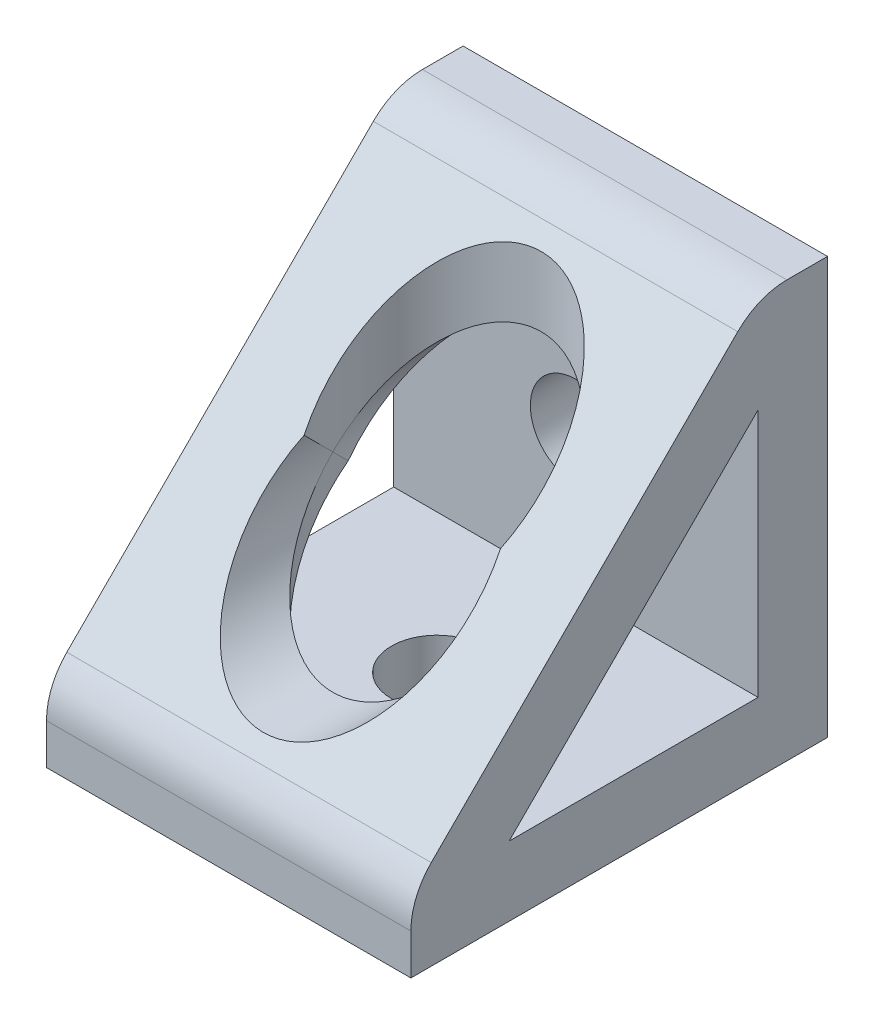
ISO-10303-21;
HEADER;
FILE_DESCRIPTION(('STEP AP214'),'2;1');
FILE_NAME('part.step','',(''),(''),'','','');
FILE_SCHEMA(('AUTOMOTIVE_DESIGN { 1 0 10303 214 1 1 1 1 }'));
ENDSEC;
DATA;
#1=APPLICATION_CONTEXT('core data for automotive mechanical design processes');
#2=APPLICATION_PROTOCOL_DEFINITION('international standard','automotive_design',2000,#1);
#3=PRODUCT_CONTEXT('',#1,'mechanical');
#4=PRODUCT('Part','Part','',(#3));
#5=PRODUCT_RELATED_PRODUCT_CATEGORY('part','',(#4));
#6=PRODUCT_DEFINITION_FORMATION('','',#4);
#7=PRODUCT_DEFINITION_CONTEXT('part definition',#1,'design');
#8=PRODUCT_DEFINITION('design','',#6,#7);
#9=PRODUCT_DEFINITION_SHAPE('','',#8);
#10=(LENGTH_UNIT() NAMED_UNIT(*) SI_UNIT(.MILLI.,.METRE.));
#11=(NAMED_UNIT(*) PLANE_ANGLE_UNIT() SI_UNIT($,.RADIAN.));
#12=(NAMED_UNIT(*) SI_UNIT($,.STERADIAN.) SOLID_ANGLE_UNIT());
#13=UNCERTAINTY_MEASURE_WITH_UNIT(LENGTH_MEASURE(1.E-05),#10,'distance_accuracy_value','');
#14=(GEOMETRIC_REPRESENTATION_CONTEXT(3) GLOBAL_UNCERTAINTY_ASSIGNED_CONTEXT((#13)) GLOBAL_UNIT_ASSIGNED_CONTEXT((#10,
#11,#12)) REPRESENTATION_CONTEXT('',''));
#15=CARTESIAN_POINT('',(0.,0.,0.));
#16=DIRECTION('',(0.,0.,1.));
#17=DIRECTION('',(1.,0.,0.));
#18=AXIS2_PLACEMENT_3D('',#15,#16,#17);
#19=CARTESIAN_POINT('',(0.,0.,-39.6407683632074));
#20=DIRECTION('',(0.,0.,1.));
#21=DIRECTION('',(1.,0.,0.));
#22=AXIS2_PLACEMENT_3D('',#19,#20,#21);
#23=CYLINDRICAL_SURFACE('',#22,9.525);
#24=CARTESIAN_POINT('',(0.,0.,0.));
#25=DIRECTION('',(0.,-0.707106781186549,0.707106781186546));
#26=DIRECTION('',(0.,0.707106781186546,0.707106781186549));
#27=AXIS2_PLACEMENT_3D('',#24,#25,#26);
#28=ELLIPSE('',#27,13.4703841816038,9.525);
#29=CARTESIAN_POINT('',(8.98025612106915,3.175,3.17500000000002));
#30=VERTEX_POINT('',#29);
#31=CARTESIAN_POINT('',(9.525,0.,0.));
#32=VERTEX_POINT('',#31);
#33=EDGE_CURVE('E62',#30,#32,#28,.F.);
#34=ORIENTED_EDGE('',*,*,#33,.T.);
#35=CARTESIAN_POINT('',(0.,0.,0.));
#36=DIRECTION('',(0.,0.707106781186546,0.707106781186549));
#37=DIRECTION('',(0.,-0.707106781186549,0.707106781186546));
#38=AXIS2_PLACEMENT_3D('',#35,#36,#37);
#39=ELLIPSE('',#38,13.4703841816037,9.525);
#40=CARTESIAN_POINT('',(-9.525,0.,0.));
#41=VERTEX_POINT('',#40);
#42=EDGE_CURVE('E11',#32,#41,#39,.F.);
#43=ORIENTED_EDGE('',*,*,#42,.T.);
#44=CARTESIAN_POINT('',(-8.98025612106915,3.175,3.17500000000002));
#45=VERTEX_POINT('',#44);
#46=EDGE_CURVE('E152',#41,#45,#28,.F.);
#47=ORIENTED_EDGE('',*,*,#46,.T.);
#48=CARTESIAN_POINT('',(0.,0.,6.35000000000003));
#49=DIRECTION('',(0.,-0.707106781186547,-0.707106781186548));
#50=DIRECTION('',(0.,-0.707106781186548,0.707106781186547));
#51=AXIS2_PLACEMENT_3D('',#48,#49,#50);
#52=ELLIPSE('',#51,13.4703841816037,9.525);
#53=EDGE_CURVE('E157',#30,#45,#52,.T.);
#54=ORIENTED_EDGE('',*,*,#53,.F.);
#55=EDGE_LOOP('',(#34,#43,#47,#54));
#56=FACE_BOUND('',#55,.T.);
#57=ADVANCED_FACE('F47',(#56),#23,.F.);
#58=CARTESIAN_POINT('',(16.6624,-15.3302561210692,12.7));
#59=DIRECTION('',(-1.,0.,0.));
#60=DIRECTION('',(0.,0.,1.));
#61=AXIS2_PLACEMENT_3D('',#58,#59,#60);
#62=PLANE('',#61);
#63=DIRECTION('',(0.,-1.,0.));
#64=VECTOR('',#63,1.);
#65=CARTESIAN_POINT('',(16.6624,-19.05,19.05));
#66=LINE('',#65,#64);
#67=CARTESIAN_POINT('',(16.6624,-15.3302561210692,19.05));
#68=VERTEX_POINT('',#67);
#69=CARTESIAN_POINT('',(16.6624,-19.05,19.05));
#70=VERTEX_POINT('',#69);
#71=EDGE_CURVE('E217',#68,#70,#66,.T.);
#72=ORIENTED_EDGE('',*,*,#71,.T.);
#73=DIRECTION('',(0.,0.,-1.));
#74=VECTOR('',#73,1.);
#75=CARTESIAN_POINT('',(16.6624,-19.05,19.05));
#76=LINE('',#75,#74);
#77=CARTESIAN_POINT('',(16.6624,-19.05,-19.05));
#78=VERTEX_POINT('',#77);
#79=EDGE_CURVE('E221',#70,#78,#76,.T.);
#80=ORIENTED_EDGE('',*,*,#79,.T.);
#81=DIRECTION('',(0.,1.,0.));
#82=VECTOR('',#81,1.);
#83=CARTESIAN_POINT('',(16.6624,-19.05,-19.05));
#84=LINE('',#83,#82);
#85=CARTESIAN_POINT('',(16.6624,19.05,-19.05));
#86=VERTEX_POINT('',#85);
#87=EDGE_CURVE('E225',#78,#86,#84,.T.);
#88=ORIENTED_EDGE('',*,*,#87,.T.);
#89=DIRECTION('',(0.,0.,1.));
#90=VECTOR('',#89,1.);
#91=CARTESIAN_POINT('',(16.6624,19.05,-15.3302561210691));
#92=LINE('',#91,#90);
#93=CARTESIAN_POINT('',(16.6624,19.05,-15.3302561210691));
#94=VERTEX_POINT('',#93);
#95=EDGE_CURVE('E228',#86,#94,#92,.T.);
#96=ORIENTED_EDGE('',*,*,#95,.T.);
#97=CARTESIAN_POINT('',(16.6624,12.7,-15.3302561210691));
#98=DIRECTION('',(1.,0.,0.));
#99=DIRECTION('',(0.,0.,-1.));
#100=AXIS2_PLACEMENT_3D('',#97,#98,#99);
#101=CIRCLE('',#100,6.35);
#102=CARTESIAN_POINT('',(16.6624,17.1901280605346,-10.8401280605346));
#103=VERTEX_POINT('',#102);
#104=EDGE_CURVE('E231',#94,#103,#101,.T.);
#105=ORIENTED_EDGE('',*,*,#104,.T.);
#106=DIRECTION('',(0.,-0.707106781186548,0.707106781186547));
#107=VECTOR('',#106,1.);
#108=CARTESIAN_POINT('',(16.6624,-10.8401280605346,17.1901280605346));
#109=LINE('',#108,#107);
#110=CARTESIAN_POINT('',(16.6624,-10.8401280605346,17.1901280605346));
#111=VERTEX_POINT('',#110);
#112=EDGE_CURVE('E234',#103,#111,#109,.T.);
#113=ORIENTED_EDGE('',*,*,#112,.T.);
#114=CARTESIAN_POINT('',(16.6624,-15.3302561210692,12.7));
#115=DIRECTION('',(1.,0.,0.));
#116=DIRECTION('',(0.,0.,1.));
#117=AXIS2_PLACEMENT_3D('',#114,#115,#116);
#118=CIRCLE('',#117,6.35);
#119=EDGE_CURVE('E237',#111,#68,#118,.T.);
#120=ORIENTED_EDGE('',*,*,#119,.T.);
#121=EDGE_LOOP('',(#72,#80,#88,#96,#105,#113,#120));
#122=FACE_BOUND('',#121,.T.);
#123=DIRECTION('',(0.,-0.707106781186548,0.707106781186547));
#124=VECTOR('',#123,1.);
#125=CARTESIAN_POINT('',(16.6624,-12.7,10.0697438789308));
#126=LINE('',#125,#124);
#127=CARTESIAN_POINT('',(16.6624,10.0697438789308,-12.7));
#128=VERTEX_POINT('',#127);
#129=CARTESIAN_POINT('',(16.6624,-12.7,10.0697438789308));
#130=VERTEX_POINT('',#129);
#131=EDGE_CURVE('E186',#128,#130,#126,.T.);
#132=ORIENTED_EDGE('',*,*,#131,.F.);
#133=DIRECTION('',(0.,1.,0.));
#134=VECTOR('',#133,1.);
#135=CARTESIAN_POINT('',(16.6624,-12.7,-12.7));
#136=LINE('',#135,#134);
#137=CARTESIAN_POINT('',(16.6624,-12.7,-12.7));
#138=VERTEX_POINT('',#137);
#139=EDGE_CURVE('E193',#138,#128,#136,.T.);
#140=ORIENTED_EDGE('',*,*,#139,.F.);
#141=DIRECTION('',(0.,0.,-1.));
#142=VECTOR('',#141,1.);
#143=CARTESIAN_POINT('',(16.6624,-12.7,10.0697438789308));
#144=LINE('',#143,#142);
#145=EDGE_CURVE('E189',#130,#138,#144,.T.);
#146=ORIENTED_EDGE('',*,*,#145,.F.);
#147=EDGE_LOOP('',(#132,#140,#146));
#148=FACE_BOUND('',#147,.T.);
#149=ADVANCED_FACE('F354',(#122,#148),#62,.F.);
#150=CARTESIAN_POINT('',(-16.6624,-15.3302561210692,12.7));
#151=DIRECTION('',(-1.,0.,0.));
#152=DIRECTION('',(0.,0.,1.));
#153=AXIS2_PLACEMENT_3D('',#150,#151,#152);
#154=PLANE('',#153);
#155=DIRECTION('',(0.,-1.,0.));
#156=VECTOR('',#155,1.);
#157=CARTESIAN_POINT('',(-16.6624,-19.05,19.05));
#158=LINE('',#157,#156);
#159=CARTESIAN_POINT('',(-16.6624,-15.3302561210692,19.05));
#160=VERTEX_POINT('',#159);
#161=CARTESIAN_POINT('',(-16.6624,-19.05,19.05));
#162=VERTEX_POINT('',#161);
#163=EDGE_CURVE('E216',#160,#162,#158,.T.);
#164=ORIENTED_EDGE('',*,*,#163,.F.);
#165=CARTESIAN_POINT('',(-16.6624,-15.3302561210692,12.7));
#166=DIRECTION('',(1.,0.,0.));
#167=DIRECTION('',(0.,0.,1.));
#168=AXIS2_PLACEMENT_3D('',#165,#166,#167);
#169=CIRCLE('',#168,6.35);
#170=CARTESIAN_POINT('',(-16.6624,-10.8401280605346,17.1901280605346));
#171=VERTEX_POINT('',#170);
#172=EDGE_CURVE('E222',#171,#160,#169,.T.);
#173=ORIENTED_EDGE('',*,*,#172,.F.);
#174=DIRECTION('',(0.,-0.707106781186548,0.707106781186547));
#175=VECTOR('',#174,1.);
#176=CARTESIAN_POINT('',(-16.6624,-10.8401280605346,17.1901280605346));
#177=LINE('',#176,#175);
#178=CARTESIAN_POINT('',(-16.6624,17.1901280605346,-10.8401280605346));
#179=VERTEX_POINT('',#178);
#180=EDGE_CURVE('E256',#179,#171,#177,.T.);
#181=ORIENTED_EDGE('',*,*,#180,.F.);
#182=CARTESIAN_POINT('',(-16.6624,12.7,-15.3302561210691));
#183=DIRECTION('',(1.,0.,0.));
#184=DIRECTION('',(0.,0.,-1.));
#185=AXIS2_PLACEMENT_3D('',#182,#183,#184);
#186=CIRCLE('',#185,6.35);
#187=CARTESIAN_POINT('',(-16.6624,19.05,-15.3302561210691));
#188=VERTEX_POINT('',#187);
#189=EDGE_CURVE('E253',#188,#179,#186,.T.);
#190=ORIENTED_EDGE('',*,*,#189,.F.);
#191=DIRECTION('',(0.,0.,1.));
#192=VECTOR('',#191,1.);
#193=CARTESIAN_POINT('',(-16.6624,19.05,-15.3302561210691));
#194=LINE('',#193,#192);
#195=CARTESIAN_POINT('',(-16.6624,19.05,-19.05));
#196=VERTEX_POINT('',#195);
#197=EDGE_CURVE('E250',#196,#188,#194,.T.);
#198=ORIENTED_EDGE('',*,*,#197,.F.);
#199=DIRECTION('',(0.,1.,0.));
#200=VECTOR('',#199,1.);
#201=CARTESIAN_POINT('',(-16.6624,-19.05,-19.05));
#202=LINE('',#201,#200);
#203=CARTESIAN_POINT('',(-16.6624,-19.05,-19.05));
#204=VERTEX_POINT('',#203);
#205=EDGE_CURVE('E247',#204,#196,#202,.T.);
#206=ORIENTED_EDGE('',*,*,#205,.F.);
#207=DIRECTION('',(0.,0.,-1.));
#208=VECTOR('',#207,1.);
#209=CARTESIAN_POINT('',(-16.6624,-19.05,19.05));
#210=LINE('',#209,#208);
#211=EDGE_CURVE('E244',#162,#204,#210,.T.);
#212=ORIENTED_EDGE('',*,*,#211,.F.);
#213=EDGE_LOOP('',(#164,#173,#181,#190,#198,#206,#212));
#214=FACE_BOUND('',#213,.T.);
#215=DIRECTION('',(0.,1.,0.));
#216=VECTOR('',#215,1.);
#217=CARTESIAN_POINT('',(-16.6624,-12.7,-12.7));
#218=LINE('',#217,#216);
#219=CARTESIAN_POINT('',(-16.6624,-12.7,-12.7));
#220=VERTEX_POINT('',#219);
#221=CARTESIAN_POINT('',(-16.6624,10.0697438789308,-12.7));
#222=VERTEX_POINT('',#221);
#223=EDGE_CURVE('E190',#220,#222,#218,.T.);
#224=ORIENTED_EDGE('',*,*,#223,.T.);
#225=DIRECTION('',(0.,-0.707106781186548,0.707106781186547));
#226=VECTOR('',#225,1.);
#227=CARTESIAN_POINT('',(-16.6624,-12.7,10.0697438789308));
#228=LINE('',#227,#226);
#229=CARTESIAN_POINT('',(-16.6624,-12.7,10.0697438789308));
#230=VERTEX_POINT('',#229);
#231=EDGE_CURVE('E185',#222,#230,#228,.T.);
#232=ORIENTED_EDGE('',*,*,#231,.T.);
#233=DIRECTION('',(0.,0.,-1.));
#234=VECTOR('',#233,1.);
#235=CARTESIAN_POINT('',(-16.6624,-12.7,10.0697438789308));
#236=LINE('',#235,#234);
#237=EDGE_CURVE('E200',#230,#220,#236,.T.);
#238=ORIENTED_EDGE('',*,*,#237,.T.);
#239=EDGE_LOOP('',(#224,#232,#238));
#240=FACE_BOUND('',#239,.T.);
#241=ADVANCED_FACE('F358',(#214,#240),#154,.T.);
#242=CARTESIAN_POINT('',(16.6624,-19.05,19.05));
#243=DIRECTION('',(0.,0.,-1.));
#244=DIRECTION('',(-1.,0.,0.));
#245=AXIS2_PLACEMENT_3D('',#242,#243,#244);
#246=PLANE('',#245);
#247=ORIENTED_EDGE('',*,*,#163,.T.);
#248=DIRECTION('',(-1.,0.,0.));
#249=VECTOR('',#248,1.);
#250=CARTESIAN_POINT('',(16.6624,-19.05,19.05));
#251=LINE('',#250,#249);
#252=EDGE_CURVE('E150',#70,#162,#251,.T.);
#253=ORIENTED_EDGE('',*,*,#252,.F.);
#254=ORIENTED_EDGE('',*,*,#71,.F.);
#255=DIRECTION('',(-1.,0.,0.));
#256=VECTOR('',#255,1.);
#257=CARTESIAN_POINT('',(16.6624,-15.3302561210692,19.05));
#258=LINE('',#257,#256);
#259=EDGE_CURVE('E240',#68,#160,#258,.T.);
#260=ORIENTED_EDGE('',*,*,#259,.T.);
#261=EDGE_LOOP('',(#247,#253,#254,#260));
#262=FACE_BOUND('',#261,.T.);
#263=ADVANCED_FACE('F49',(#262),#246,.F.);
#264=CARTESIAN_POINT('',(16.6624,-19.05,19.05));
#265=DIRECTION('',(0.,1.,0.));
#266=DIRECTION('',(0.,0.,1.));
#267=AXIS2_PLACEMENT_3D('',#264,#265,#266);
#268=PLANE('',#267);
#269=CARTESIAN_POINT('',(0.,-19.05,0.));
#270=DIRECTION('',(0.,1.,0.));
#271=DIRECTION('',(0.,0.,1.));
#272=AXIS2_PLACEMENT_3D('',#269,#270,#271);
#273=CIRCLE('',#272,4.1656);
#274=CARTESIAN_POINT('',(0.,-19.05,4.16560000000001));
#275=VERTEX_POINT('',#274);
#276=EDGE_CURVE('E181',#275,#275,#273,.F.);
#277=ORIENTED_EDGE('',*,*,#276,.F.);
#278=EDGE_LOOP('',(#277));
#279=FACE_BOUND('',#278,.T.);
#280=ORIENTED_EDGE('',*,*,#211,.T.);
#281=DIRECTION('',(-1.,0.,0.));
#282=VECTOR('',#281,1.);
#283=CARTESIAN_POINT('',(16.6624,-19.05,-19.05));
#284=LINE('',#283,#282);
#285=EDGE_CURVE('E280',#78,#204,#284,.T.);
#286=ORIENTED_EDGE('',*,*,#285,.F.);
#287=ORIENTED_EDGE('',*,*,#79,.F.);
#288=ORIENTED_EDGE('',*,*,#252,.T.);
#289=EDGE_LOOP('',(#280,#286,#287,#288));
#290=FACE_BOUND('',#289,.T.);
#291=ADVANCED_FACE('F404',(#279,#290),#268,.F.);
#292=CARTESIAN_POINT('',(16.6624,-19.05,-19.05));
#293=DIRECTION('',(0.,0.,1.));
#294=DIRECTION('',(0.,-1.,0.));
#295=AXIS2_PLACEMENT_3D('',#292,#293,#294);
#296=PLANE('',#295);
#297=CARTESIAN_POINT('',(0.,0.,-19.05));
#298=DIRECTION('',(0.,0.,1.));
#299=DIRECTION('',(0.,-1.,0.));
#300=AXIS2_PLACEMENT_3D('',#297,#298,#299);
#301=CIRCLE('',#300,4.1656);
#302=CARTESIAN_POINT('',(4.1656,0.,-19.05));
#303=VERTEX_POINT('',#302);
#304=EDGE_CURVE('E169',#303,#303,#301,.F.);
#305=ORIENTED_EDGE('',*,*,#304,.F.);
#306=EDGE_LOOP('',(#305));
#307=FACE_BOUND('',#306,.T.);
#308=ORIENTED_EDGE('',*,*,#205,.T.);
#309=DIRECTION('',(-1.,0.,0.));
#310=VECTOR('',#309,1.);
#311=CARTESIAN_POINT('',(16.6624,19.05,-19.05));
#312=LINE('',#311,#310);
#313=EDGE_CURVE('E276',#86,#196,#312,.T.);
#314=ORIENTED_EDGE('',*,*,#313,.F.);
#315=ORIENTED_EDGE('',*,*,#87,.F.);
#316=ORIENTED_EDGE('',*,*,#285,.T.);
#317=EDGE_LOOP('',(#308,#314,#315,#316));
#318=FACE_BOUND('',#317,.T.);
#319=ADVANCED_FACE('F401',(#307,#318),#296,.F.);
#320=CARTESIAN_POINT('',(16.6624,19.05,-15.3302561210691));
#321=DIRECTION('',(0.,-1.,0.));
#322=DIRECTION('',(0.,0.,-1.));
#323=AXIS2_PLACEMENT_3D('',#320,#321,#322);
#324=PLANE('',#323);
#325=ORIENTED_EDGE('',*,*,#197,.T.);
#326=DIRECTION('',(-1.,0.,0.));
#327=VECTOR('',#326,1.);
#328=CARTESIAN_POINT('',(16.6624,19.05,-15.3302561210691));
#329=LINE('',#328,#327);
#330=EDGE_CURVE('E272',#94,#188,#329,.T.);
#331=ORIENTED_EDGE('',*,*,#330,.F.);
#332=ORIENTED_EDGE('',*,*,#95,.F.);
#333=ORIENTED_EDGE('',*,*,#313,.T.);
#334=EDGE_LOOP('',(#325,#331,#332,#333));
#335=FACE_BOUND('',#334,.T.);
#336=ADVANCED_FACE('F397',(#335),#324,.F.);
#337=CARTESIAN_POINT('',(16.6624,12.7,-15.3302561210691));
#338=DIRECTION('',(-1.,0.,0.));
#339=DIRECTION('',(0.,0.,1.));
#340=AXIS2_PLACEMENT_3D('',#337,#338,#339);
#341=CYLINDRICAL_SURFACE('',#340,6.35);
#342=ORIENTED_EDGE('',*,*,#189,.T.);
#343=DIRECTION('',(-1.,0.,0.));
#344=VECTOR('',#343,1.);
#345=CARTESIAN_POINT('',(16.6624,17.1901280605346,-10.8401280605346));
#346=LINE('',#345,#344);
#347=EDGE_CURVE('E268',#103,#179,#346,.T.);
#348=ORIENTED_EDGE('',*,*,#347,.F.);
#349=ORIENTED_EDGE('',*,*,#104,.F.);
#350=ORIENTED_EDGE('',*,*,#330,.T.);
#351=EDGE_LOOP('',(#342,#348,#349,#350));
#352=FACE_BOUND('',#351,.T.);
#353=ADVANCED_FACE('F394',(#352),#341,.T.);
#354=CARTESIAN_POINT('',(16.6624,-10.8401280605346,17.1901280605346));
#355=DIRECTION('',(0.,-0.707106781186547,-0.707106781186548));
#356=DIRECTION('',(0.,0.707106781186548,-0.707106781186547));
#357=AXIS2_PLACEMENT_3D('',#354,#355,#356);
#358=PLANE('',#357);
#359=ORIENTED_EDGE('',*,*,#53,.T.);
#360=CARTESIAN_POINT('',(0.,6.34999999999999,0.));
#361=DIRECTION('',(0.,-0.707106781186547,-0.707106781186548));
#362=DIRECTION('',(0.,0.707106781186548,-0.707106781186547));
#363=AXIS2_PLACEMENT_3D('',#360,#361,#362);
#364=ELLIPSE('',#363,13.4703841816037,9.525);
#365=EDGE_CURVE('E144',#45,#30,#364,.T.);
#366=ORIENTED_EDGE('',*,*,#365,.T.);
#367=EDGE_LOOP('',(#359,#366));
#368=FACE_BOUND('',#367,.T.);
#369=ORIENTED_EDGE('',*,*,#180,.T.);
#370=DIRECTION('',(-1.,0.,0.));
#371=VECTOR('',#370,1.);
#372=CARTESIAN_POINT('',(16.6624,-10.8401280605346,17.1901280605346));
#373=LINE('',#372,#371);
#374=EDGE_CURVE('E264',#111,#171,#373,.T.);
#375=ORIENTED_EDGE('',*,*,#374,.F.);
#376=ORIENTED_EDGE('',*,*,#112,.F.);
#377=ORIENTED_EDGE('',*,*,#347,.T.);
#378=EDGE_LOOP('',(#369,#375,#376,#377));
#379=FACE_BOUND('',#378,.T.);
#380=ADVANCED_FACE('F155',(#368,#379),#358,.F.);
#381=CARTESIAN_POINT('',(16.6624,-15.3302561210692,12.7));
#382=DIRECTION('',(-1.,0.,0.));
#383=DIRECTION('',(0.,0.,1.));
#384=AXIS2_PLACEMENT_3D('',#381,#382,#383);
#385=CYLINDRICAL_SURFACE('',#384,6.35);
#386=ORIENTED_EDGE('',*,*,#172,.T.);
#387=ORIENTED_EDGE('',*,*,#259,.F.);
#388=ORIENTED_EDGE('',*,*,#119,.F.);
#389=ORIENTED_EDGE('',*,*,#374,.T.);
#390=EDGE_LOOP('',(#386,#387,#388,#389));
#391=FACE_BOUND('',#390,.T.);
#392=ADVANCED_FACE('F384',(#391),#385,.T.);
#393=CARTESIAN_POINT('',(16.6624,-12.7,10.0697438789308));
#394=DIRECTION('',(0.,-0.707106781186547,-0.707106781186548));
#395=DIRECTION('',(0.,0.707106781186548,-0.707106781186547));
#396=AXIS2_PLACEMENT_3D('',#393,#394,#395);
#397=PLANE('',#396);
#398=CARTESIAN_POINT('',(0.,-2.63025612106916,0.));
#399=DIRECTION('',(0.,-0.707106781186547,-0.707106781186548));
#400=DIRECTION('',(0.,0.707106781186548,-0.707106781186547));
#401=AXIS2_PLACEMENT_3D('',#398,#399,#400);
#402=ELLIPSE('',#401,13.4703841816037,9.525);
#403=CARTESIAN_POINT('',(9.4337724789394,-1.31512806053458,-1.31512806053458));
#404=VERTEX_POINT('',#403);
#405=CARTESIAN_POINT('',(-9.43377247893941,-1.31512806053458,-1.31512806053458));
#406=VERTEX_POINT('',#405);
#407=EDGE_CURVE('E160',#404,#406,#402,.T.);
#408=ORIENTED_EDGE('',*,*,#407,.F.);
#409=CARTESIAN_POINT('',(0.,0.,-2.63025612106915));
#410=DIRECTION('',(0.,-0.707106781186547,-0.707106781186548));
#411=DIRECTION('',(0.,-0.707106781186548,0.707106781186547));
#412=AXIS2_PLACEMENT_3D('',#409,#410,#411);
#413=ELLIPSE('',#412,13.4703841816037,9.525);
#414=EDGE_CURVE('E159',#406,#404,#413,.T.);
#415=ORIENTED_EDGE('',*,*,#414,.F.);
#416=EDGE_LOOP('',(#408,#415));
#417=FACE_BOUND('',#416,.T.);
#418=ORIENTED_EDGE('',*,*,#231,.F.);
#419=DIRECTION('',(-1.,0.,0.));
#420=VECTOR('',#419,1.);
#421=CARTESIAN_POINT('',(16.6624,10.0697438789308,-12.7));
#422=LINE('',#421,#420);
#423=EDGE_CURVE('E196',#128,#222,#422,.T.);
#424=ORIENTED_EDGE('',*,*,#423,.F.);
#425=ORIENTED_EDGE('',*,*,#131,.T.);
#426=DIRECTION('',(-1.,0.,0.));
#427=VECTOR('',#426,1.);
#428=CARTESIAN_POINT('',(16.6624,-12.7,10.0697438789308));
#429=LINE('',#428,#427);
#430=EDGE_CURVE('E212',#130,#230,#429,.T.);
#431=ORIENTED_EDGE('',*,*,#430,.T.);
#432=EDGE_LOOP('',(#418,#424,#425,#431));
#433=FACE_BOUND('',#432,.T.);
#434=ADVANCED_FACE('F339',(#417,#433),#397,.T.);
#435=CARTESIAN_POINT('',(16.6624,-12.7,10.0697438789308));
#436=DIRECTION('',(0.,1.,0.));
#437=DIRECTION('',(0.,0.,1.));
#438=AXIS2_PLACEMENT_3D('',#435,#436,#437);
#439=PLANE('',#438);
#440=ORIENTED_EDGE('',*,*,#237,.F.);
#441=ORIENTED_EDGE('',*,*,#430,.F.);
#442=ORIENTED_EDGE('',*,*,#145,.T.);
#443=DIRECTION('',(-1.,0.,0.));
#444=VECTOR('',#443,1.);
#445=CARTESIAN_POINT('',(16.6624,-12.7,-12.7));
#446=LINE('',#445,#444);
#447=EDGE_CURVE('E70',#138,#220,#446,.T.);
#448=ORIENTED_EDGE('',*,*,#447,.T.);
#449=EDGE_LOOP('',(#440,#441,#442,#448));
#450=FACE_BOUND('',#449,.T.);
#451=CARTESIAN_POINT('',(0.,-12.7,0.));
#452=DIRECTION('',(0.,1.,0.));
#453=DIRECTION('',(0.,0.,1.));
#454=AXIS2_PLACEMENT_3D('',#451,#452,#453);
#455=CIRCLE('',#454,4.1656);
#456=CARTESIAN_POINT('',(0.,-12.7,4.16560000000001));
#457=VERTEX_POINT('',#456);
#458=EDGE_CURVE('E177',#457,#457,#455,.T.);
#459=ORIENTED_EDGE('',*,*,#458,.F.);
#460=EDGE_LOOP('',(#459));
#461=FACE_BOUND('',#460,.T.);
#462=ADVANCED_FACE('F379',(#450,#461),#439,.T.);
#463=CARTESIAN_POINT('',(16.6624,-12.7,-12.7));
#464=DIRECTION('',(0.,0.,1.));
#465=DIRECTION('',(1.,0.,0.));
#466=AXIS2_PLACEMENT_3D('',#463,#464,#465);
#467=PLANE('',#466);
#468=ORIENTED_EDGE('',*,*,#223,.F.);
#469=ORIENTED_EDGE('',*,*,#447,.F.);
#470=ORIENTED_EDGE('',*,*,#139,.T.);
#471=ORIENTED_EDGE('',*,*,#423,.T.);
#472=EDGE_LOOP('',(#468,#469,#470,#471));
#473=FACE_BOUND('',#472,.T.);
#474=CARTESIAN_POINT('',(0.,0.,-12.7));
#475=DIRECTION('',(0.,0.,1.));
#476=DIRECTION('',(1.,0.,0.));
#477=AXIS2_PLACEMENT_3D('',#474,#475,#476);
#478=CIRCLE('',#477,4.1656);
#479=CARTESIAN_POINT('',(4.1656,0.,-12.7));
#480=VERTEX_POINT('',#479);
#481=EDGE_CURVE('E163',#480,#480,#478,.T.);
#482=ORIENTED_EDGE('',*,*,#481,.F.);
#483=EDGE_LOOP('',(#482));
#484=FACE_BOUND('',#483,.T.);
#485=ADVANCED_FACE('F372',(#473,#484),#467,.T.);
#486=CARTESIAN_POINT('',(0.,-19.051,0.));
#487=DIRECTION('',(0.,1.,0.));
#488=DIRECTION('',(0.,0.,1.));
#489=AXIS2_PLACEMENT_3D('',#486,#487,#488);
#490=CYLINDRICAL_SURFACE('',#489,4.1656);
#491=CARTESIAN_POINT('',(0.,-12.7,4.16560000000001));
#492=CARTESIAN_POINT('',(0.,-12.7661458333333,4.16560000000001));
#493=CARTESIAN_POINT('',(0.,-12.8322916666667,4.16560000000001));
#494=CARTESIAN_POINT('',(0.,-12.9645833333333,4.16560000000001));
#495=CARTESIAN_POINT('',(0.,-13.0307291666667,4.16560000000001));
#496=CARTESIAN_POINT('',(0.,-13.1630208333333,4.16560000000001));
#497=CARTESIAN_POINT('',(0.,-13.2291666666667,4.16560000000001));
#498=CARTESIAN_POINT('',(0.,-13.3614583333333,4.16560000000001));
#499=CARTESIAN_POINT('',(0.,-13.4276041666667,4.16560000000001));
#500=CARTESIAN_POINT('',(0.,-13.5598958333333,4.16560000000001));
#501=CARTESIAN_POINT('',(0.,-13.6260416666667,4.16560000000001));
#502=CARTESIAN_POINT('',(0.,-13.7583333333333,4.16560000000001));
#503=CARTESIAN_POINT('',(0.,-13.8244791666667,4.16560000000001));
#504=CARTESIAN_POINT('',(0.,-13.9567708333333,4.16560000000001));
#505=CARTESIAN_POINT('',(0.,-14.0229166666667,4.16560000000001));
#506=CARTESIAN_POINT('',(0.,-14.1552083333333,4.16560000000001));
#507=CARTESIAN_POINT('',(0.,-14.2213541666667,4.16560000000001));
#508=CARTESIAN_POINT('',(0.,-14.3536458333333,4.16560000000001));
#509=CARTESIAN_POINT('',(0.,-14.4197916666667,4.16560000000001));
#510=CARTESIAN_POINT('',(0.,-14.5520833333333,4.16560000000001));
#511=CARTESIAN_POINT('',(0.,-14.6182291666667,4.16560000000001));
#512=CARTESIAN_POINT('',(0.,-14.7505208333333,4.16560000000001));
#513=CARTESIAN_POINT('',(0.,-14.8166666666667,4.16560000000001));
#514=CARTESIAN_POINT('',(0.,-14.9489583333333,4.16560000000001));
#515=CARTESIAN_POINT('',(0.,-15.0151041666667,4.16560000000001));
#516=CARTESIAN_POINT('',(0.,-15.1473958333333,4.16560000000001));
#517=CARTESIAN_POINT('',(0.,-15.2135416666667,4.16560000000001));
#518=CARTESIAN_POINT('',(0.,-15.3458333333333,4.16560000000001));
#519=CARTESIAN_POINT('',(0.,-15.4119791666667,4.16560000000001));
#520=CARTESIAN_POINT('',(0.,-15.5442708333333,4.16560000000001));
#521=CARTESIAN_POINT('',(0.,-15.6104166666667,4.16560000000001));
#522=CARTESIAN_POINT('',(0.,-15.7427083333333,4.16560000000001));
#523=CARTESIAN_POINT('',(0.,-15.8088541666667,4.16560000000001));
#524=CARTESIAN_POINT('',(0.,-15.9411458333333,4.16560000000001));
#525=CARTESIAN_POINT('',(0.,-16.0072916666667,4.16560000000001));
#526=CARTESIAN_POINT('',(0.,-16.1395833333333,4.16560000000001));
#527=CARTESIAN_POINT('',(0.,-16.2057291666667,4.16560000000001));
#528=CARTESIAN_POINT('',(0.,-16.3380208333333,4.16560000000001));
#529=CARTESIAN_POINT('',(0.,-16.4041666666667,4.16560000000001));
#530=CARTESIAN_POINT('',(0.,-16.5364583333333,4.16560000000001));
#531=CARTESIAN_POINT('',(0.,-16.6026041666667,4.16560000000001));
#532=CARTESIAN_POINT('',(0.,-16.7348958333333,4.16560000000001));
#533=CARTESIAN_POINT('',(0.,-16.8010416666667,4.16560000000001));
#534=CARTESIAN_POINT('',(0.,-16.9333333333333,4.16560000000001));
#535=CARTESIAN_POINT('',(0.,-16.9994791666667,4.16560000000001));
#536=CARTESIAN_POINT('',(0.,-17.1317708333333,4.16560000000001));
#537=CARTESIAN_POINT('',(0.,-17.1979166666667,4.16560000000001));
#538=CARTESIAN_POINT('',(0.,-17.3302083333333,4.16560000000001));
#539=CARTESIAN_POINT('',(0.,-17.3963541666667,4.16560000000001));
#540=CARTESIAN_POINT('',(0.,-17.5286458333333,4.16560000000001));
#541=CARTESIAN_POINT('',(0.,-17.5947916666667,4.16560000000001));
#542=CARTESIAN_POINT('',(0.,-17.7270833333333,4.16560000000001));
#543=CARTESIAN_POINT('',(0.,-17.7932291666667,4.16560000000001));
#544=CARTESIAN_POINT('',(0.,-17.9255208333333,4.16560000000001));
#545=CARTESIAN_POINT('',(0.,-17.9916666666667,4.16560000000001));
#546=CARTESIAN_POINT('',(0.,-18.1239583333333,4.16560000000001));
#547=CARTESIAN_POINT('',(0.,-18.1901041666667,4.16560000000001));
#548=CARTESIAN_POINT('',(0.,-18.3223958333333,4.16560000000001));
#549=CARTESIAN_POINT('',(0.,-18.3885416666667,4.16560000000001));
#550=CARTESIAN_POINT('',(0.,-18.5208333333333,4.16560000000001));
#551=CARTESIAN_POINT('',(0.,-18.5869791666667,4.16560000000001));
#552=CARTESIAN_POINT('',(0.,-18.7192708333333,4.16560000000001));
#553=CARTESIAN_POINT('',(0.,-18.7854166666667,4.16560000000001));
#554=CARTESIAN_POINT('',(0.,-18.9177083333333,4.16560000000001));
#555=CARTESIAN_POINT('',(0.,-18.9838541666667,4.16560000000001));
#556=CARTESIAN_POINT('',(0.,-19.05,4.16560000000001));
#557=B_SPLINE_CURVE_WITH_KNOTS('',3,(#491,#492,#493,#494,#495,#496,#497,#498,#499,#500,#501,
#502,#503,#504,#505,#506,#507,#508,#509,#510,#511,#512,#513,#514,#515,#516,#517,#518,#519,#520,
#521,#522,#523,#524,#525,#526,#527,#528,#529,#530,#531,#532,#533,#534,#535,#536,#537,#538,#539,
#540,#541,#542,#543,#544,#545,#546,#547,#548,#549,#550,#551,#552,#553,#554,#555,#556),
.UNSPECIFIED.,.F.,.F.,(4,2,2,2,2,2,2,2,2,2,2,2,2,2,2,2,2,2,2,2,2,2,2,2,2,2,2,2,2,2,2,2,4),(0.,
0.198437500000001,0.396875000000001,0.5953125,0.793750000000001,0.992187500000002,1.190625,
1.3890625,1.5875,1.7859375,1.984375,2.1828125,2.38125,2.5796875,2.778125,2.9765625,3.175,
3.3734375,3.571875,3.7703125,3.96875,4.1671875,4.365625,4.5640625,4.7625,4.9609375,5.159375,
5.3578125,5.55625,5.7546875,5.953125,6.1515625,6.35),.UNSPECIFIED.);
#558=EDGE_CURVE('BSEAM367',#457,#275,#557,.T.);
#559=ORIENTED_EDGE('',*,*,#458,.T.);
#560=ORIENTED_EDGE('',*,*,#276,.T.);
#561=ORIENTED_EDGE('',*,*,#558,.T.);
#562=ORIENTED_EDGE('',*,*,#558,.F.);
#563=EDGE_LOOP('',(#559,#561,#560,#562));
#564=FACE_BOUND('',#563,.T.);
#565=ADVANCED_FACE('F367',(#564),#490,.F.);
#566=CARTESIAN_POINT('',(0.,0.,-19.051));
#567=DIRECTION('',(0.,0.,1.));
#568=DIRECTION('',(1.,0.,0.));
#569=AXIS2_PLACEMENT_3D('',#566,#567,#568);
#570=CYLINDRICAL_SURFACE('',#569,4.1656);
#571=CARTESIAN_POINT('',(4.1656,0.,-12.7));
#572=CARTESIAN_POINT('',(4.1656,0.,-12.7661458333333));
#573=CARTESIAN_POINT('',(4.1656,0.,-12.8322916666667));
#574=CARTESIAN_POINT('',(4.1656,0.,-12.9645833333333));
#575=CARTESIAN_POINT('',(4.1656,0.,-13.0307291666667));
#576=CARTESIAN_POINT('',(4.1656,0.,-13.1630208333333));
#577=CARTESIAN_POINT('',(4.1656,0.,-13.2291666666667));
#578=CARTESIAN_POINT('',(4.1656,0.,-13.3614583333333));
#579=CARTESIAN_POINT('',(4.1656,0.,-13.4276041666667));
#580=CARTESIAN_POINT('',(4.1656,0.,-13.5598958333333));
#581=CARTESIAN_POINT('',(4.1656,0.,-13.6260416666667));
#582=CARTESIAN_POINT('',(4.1656,0.,-13.7583333333333));
#583=CARTESIAN_POINT('',(4.1656,0.,-13.8244791666667));
#584=CARTESIAN_POINT('',(4.1656,0.,-13.9567708333333));
#585=CARTESIAN_POINT('',(4.1656,0.,-14.0229166666667));
#586=CARTESIAN_POINT('',(4.1656,0.,-14.1552083333333));
#587=CARTESIAN_POINT('',(4.1656,0.,-14.2213541666667));
#588=CARTESIAN_POINT('',(4.1656,0.,-14.3536458333333));
#589=CARTESIAN_POINT('',(4.1656,0.,-14.4197916666667));
#590=CARTESIAN_POINT('',(4.1656,0.,-14.5520833333333));
#591=CARTESIAN_POINT('',(4.1656,0.,-14.6182291666667));
#592=CARTESIAN_POINT('',(4.1656,0.,-14.7505208333333));
#593=CARTESIAN_POINT('',(4.1656,0.,-14.8166666666667));
#594=CARTESIAN_POINT('',(4.1656,0.,-14.9489583333333));
#595=CARTESIAN_POINT('',(4.1656,0.,-15.0151041666667));
#596=CARTESIAN_POINT('',(4.1656,0.,-15.1473958333333));
#597=CARTESIAN_POINT('',(4.1656,0.,-15.2135416666667));
#598=CARTESIAN_POINT('',(4.1656,0.,-15.3458333333333));
#599=CARTESIAN_POINT('',(4.1656,0.,-15.4119791666667));
#600=CARTESIAN_POINT('',(4.1656,0.,-15.5442708333333));
#601=CARTESIAN_POINT('',(4.1656,0.,-15.6104166666667));
#602=CARTESIAN_POINT('',(4.1656,0.,-15.7427083333333));
#603=CARTESIAN_POINT('',(4.1656,0.,-15.8088541666667));
#604=CARTESIAN_POINT('',(4.1656,0.,-15.9411458333333));
#605=CARTESIAN_POINT('',(4.1656,0.,-16.0072916666667));
#606=CARTESIAN_POINT('',(4.1656,0.,-16.1395833333333));
#607=CARTESIAN_POINT('',(4.1656,0.,-16.2057291666667));
#608=CARTESIAN_POINT('',(4.1656,0.,-16.3380208333333));
#609=CARTESIAN_POINT('',(4.1656,0.,-16.4041666666667));
#610=CARTESIAN_POINT('',(4.1656,0.,-16.5364583333333));
#611=CARTESIAN_POINT('',(4.1656,0.,-16.6026041666667));
#612=CARTESIAN_POINT('',(4.1656,0.,-16.7348958333333));
#613=CARTESIAN_POINT('',(4.1656,0.,-16.8010416666667));
#614=CARTESIAN_POINT('',(4.1656,0.,-16.9333333333333));
#615=CARTESIAN_POINT('',(4.1656,0.,-16.9994791666667));
#616=CARTESIAN_POINT('',(4.1656,0.,-17.1317708333333));
#617=CARTESIAN_POINT('',(4.1656,0.,-17.1979166666667));
#618=CARTESIAN_POINT('',(4.1656,0.,-17.3302083333333));
#619=CARTESIAN_POINT('',(4.1656,0.,-17.3963541666667));
#620=CARTESIAN_POINT('',(4.1656,0.,-17.5286458333333));
#621=CARTESIAN_POINT('',(4.1656,0.,-17.5947916666667));
#622=CARTESIAN_POINT('',(4.1656,0.,-17.7270833333333));
#623=CARTESIAN_POINT('',(4.1656,0.,-17.7932291666667));
#624=CARTESIAN_POINT('',(4.1656,0.,-17.9255208333333));
#625=CARTESIAN_POINT('',(4.1656,0.,-17.9916666666667));
#626=CARTESIAN_POINT('',(4.1656,0.,-18.1239583333333));
#627=CARTESIAN_POINT('',(4.1656,0.,-18.1901041666667));
#628=CARTESIAN_POINT('',(4.1656,0.,-18.3223958333333));
#629=CARTESIAN_POINT('',(4.1656,0.,-18.3885416666667));
#630=CARTESIAN_POINT('',(4.1656,0.,-18.5208333333333));
#631=CARTESIAN_POINT('',(4.1656,0.,-18.5869791666667));
#632=CARTESIAN_POINT('',(4.1656,0.,-18.7192708333333));
#633=CARTESIAN_POINT('',(4.1656,0.,-18.7854166666667));
#634=CARTESIAN_POINT('',(4.1656,0.,-18.9177083333333));
#635=CARTESIAN_POINT('',(4.1656,0.,-18.9838541666667));
#636=CARTESIAN_POINT('',(4.1656,0.,-19.05));
#637=B_SPLINE_CURVE_WITH_KNOTS('',3,(#571,#572,#573,#574,#575,#576,#577,#578,#579,#580,#581,
#582,#583,#584,#585,#586,#587,#588,#589,#590,#591,#592,#593,#594,#595,#596,#597,#598,#599,#600,
#601,#602,#603,#604,#605,#606,#607,#608,#609,#610,#611,#612,#613,#614,#615,#616,#617,#618,#619,
#620,#621,#622,#623,#624,#625,#626,#627,#628,#629,#630,#631,#632,#633,#634,#635,#636),
.UNSPECIFIED.,.F.,.F.,(4,2,2,2,2,2,2,2,2,2,2,2,2,2,2,2,2,2,2,2,2,2,2,2,2,2,2,2,2,2,2,2,4),(0.,
0.198437500000001,0.396875000000001,0.5953125,0.793750000000003,0.992187500000002,1.190625,
1.3890625,1.5875,1.7859375,1.984375,2.1828125,2.38125,2.5796875,2.778125,2.9765625,3.175,
3.3734375,3.57187500000001,3.7703125,3.96875,4.16718750000001,4.365625,4.5640625,
4.76250000000001,4.96093750000001,5.159375,5.35781250000001,5.55625000000001,5.75468750000001,
5.95312500000001,6.15156250000001,6.35000000000001),.UNSPECIFIED.);
#638=EDGE_CURVE('BSEAM363',#480,#303,#637,.T.);
#639=ORIENTED_EDGE('',*,*,#481,.T.);
#640=ORIENTED_EDGE('',*,*,#304,.T.);
#641=ORIENTED_EDGE('',*,*,#638,.T.);
#642=ORIENTED_EDGE('',*,*,#638,.F.);
#643=EDGE_LOOP('',(#639,#641,#640,#642));
#644=FACE_BOUND('',#643,.T.);
#645=ADVANCED_FACE('F363',(#644),#570,.F.);
#646=CARTESIAN_POINT('',(0.,0.,0.));
#647=DIRECTION('',(0.,-0.707106781186549,0.707106781186546));
#648=DIRECTION('',(0.,0.707106781186546,0.707106781186549));
#649=AXIS2_PLACEMENT_3D('',#646,#647,#648);
#650=ELLIPSE('',#649,13.4703841816038,9.525);
#651=EDGE_CURVE('E149',#404,#32,#650,.T.);
#652=ORIENTED_EDGE('',*,*,#651,.T.);
#653=CARTESIAN_POINT('',(0.,0.,0.));
#654=DIRECTION('',(0.,0.707106781186546,0.707106781186549));
#655=DIRECTION('',(0.,-0.707106781186549,0.707106781186546));
#656=AXIS2_PLACEMENT_3D('',#653,#654,#655);
#657=ELLIPSE('',#656,13.4703841816037,9.525);
#658=EDGE_CURVE('E56',#32,#41,#657,.T.);
#659=ORIENTED_EDGE('',*,*,#658,.T.);
#660=EDGE_CURVE('E289',#41,#406,#650,.T.);
#661=ORIENTED_EDGE('',*,*,#660,.T.);
#662=ORIENTED_EDGE('',*,*,#414,.T.);
#663=EDGE_LOOP('',(#652,#659,#661,#662));
#664=FACE_BOUND('',#663,.T.);
#665=ADVANCED_FACE('F335',(#664),#23,.F.);
#666=CARTESIAN_POINT('',(0.,-39.6407683632074,-1.44424115021308E-13));
#667=DIRECTION('',(0.,1.,0.));
#668=DIRECTION('',(0.,0.,1.));
#669=AXIS2_PLACEMENT_3D('',#666,#667,#668);
#670=CYLINDRICAL_SURFACE('',#669,9.525);
#671=ORIENTED_EDGE('',*,*,#33,.F.);
#672=ORIENTED_EDGE('',*,*,#365,.F.);
#673=ORIENTED_EDGE('',*,*,#46,.F.);
#674=ORIENTED_EDGE('',*,*,#658,.F.);
#675=EDGE_LOOP('',(#671,#672,#673,#674));
#676=FACE_BOUND('',#675,.T.);
#677=ADVANCED_FACE('F142',(#676),#670,.F.);
#678=ORIENTED_EDGE('',*,*,#651,.F.);
#679=ORIENTED_EDGE('',*,*,#407,.T.);
#680=ORIENTED_EDGE('',*,*,#660,.F.);
#681=ORIENTED_EDGE('',*,*,#42,.F.);
#682=EDGE_LOOP('',(#678,#679,#680,#681));
#683=FACE_BOUND('',#682,.T.);
#684=ADVANCED_FACE('F346',(#683),#670,.F.);
#685=CLOSED_SHELL('',(#57,#149,#241,#263,#291,#319,#336,#353,#380,#392,#434,#462,#485,#565,#645,
#665,#677,#684));
#686=MANIFOLD_SOLID_BREP('B2',#685);
#687=ADVANCED_BREP_SHAPE_REPRESENTATION('',(#18,#686),#14);
#688=SHAPE_DEFINITION_REPRESENTATION(#9,#687);
ENDSEC;
END-ISO-10303-21;
